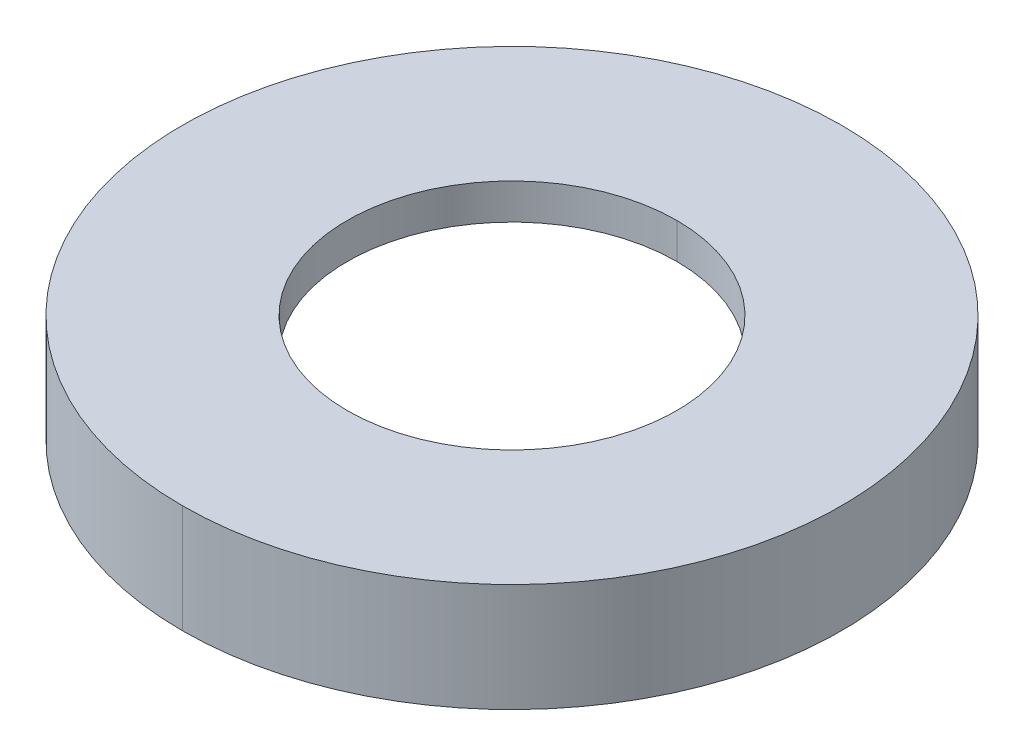
ISO-10303-21;
HEADER;
FILE_DESCRIPTION(('STEP AP214'),'2;1');
FILE_NAME('part.step','',(''),(''),'','','');
FILE_SCHEMA(('AUTOMOTIVE_DESIGN { 1 0 10303 214 1 1 1 1 }'));
ENDSEC;
DATA;
#1=APPLICATION_CONTEXT('core data for automotive mechanical design processes');
#2=APPLICATION_PROTOCOL_DEFINITION('international standard','automotive_design',2000,#1);
#3=PRODUCT_CONTEXT('',#1,'mechanical');
#4=PRODUCT('Part','Part','',(#3));
#5=PRODUCT_RELATED_PRODUCT_CATEGORY('part','',(#4));
#6=PRODUCT_DEFINITION_FORMATION('','',#4);
#7=PRODUCT_DEFINITION_CONTEXT('part definition',#1,'design');
#8=PRODUCT_DEFINITION('design','',#6,#7);
#9=PRODUCT_DEFINITION_SHAPE('','',#8);
#10=(LENGTH_UNIT() NAMED_UNIT(*) SI_UNIT(.MILLI.,.METRE.));
#11=(NAMED_UNIT(*) PLANE_ANGLE_UNIT() SI_UNIT($,.RADIAN.));
#12=(NAMED_UNIT(*) SI_UNIT($,.STERADIAN.) SOLID_ANGLE_UNIT());
#13=UNCERTAINTY_MEASURE_WITH_UNIT(LENGTH_MEASURE(1.E-05),#10,'distance_accuracy_value','');
#14=(GEOMETRIC_REPRESENTATION_CONTEXT(3) GLOBAL_UNCERTAINTY_ASSIGNED_CONTEXT((#13)) GLOBAL_UNIT_ASSIGNED_CONTEXT((#10,
#11,#12)) REPRESENTATION_CONTEXT('',''));
#15=CARTESIAN_POINT('',(0.,0.,0.));
#16=DIRECTION('',(0.,0.,1.));
#17=DIRECTION('',(1.,0.,0.));
#18=AXIS2_PLACEMENT_3D('',#15,#16,#17);
#19=CARTESIAN_POINT('',(2.79398899849514E-13,-5.2999999999933,0.));
#20=DIRECTION('',(0.,-1.,0.));
#21=DIRECTION('',(0.,0.,-1.));
#22=AXIS2_PLACEMENT_3D('',#19,#20,#21);
#23=DEGENERATE_TOROIDAL_SURFACE('',#22,2.02725465393598,6.99999999999153,.T.);
#24=CARTESIAN_POINT('',(-3.96438524369324E-13,0.966382675735436,0.));
#25=DIRECTION('',(0.,1.,0.));
#26=DIRECTION('',(0.,0.,1.));
#27=AXIS2_PLACEMENT_3D('',#24,#25,#26);
#28=CIRCLE('',#27,5.14694184357633);
#29=CARTESIAN_POINT('',(0.,0.966382675735494,-5.14694184357629));
#30=VERTEX_POINT('',#29);
#31=CARTESIAN_POINT('',(0.,0.966382675735459,5.14694184357637));
#32=VERTEX_POINT('',#31);
#33=EDGE_CURVE('E93',#30,#32,#28,.T.);
#34=ORIENTED_EDGE('',*,*,#33,.T.);
#35=CARTESIAN_POINT('',(-1.36018807453488E-12,-5.29999999999346,2.0272546539361));
#36=DIRECTION('',(1.,-2.06017321186292E-13,0.));
#37=DIRECTION('',(2.06017321186292E-13,1.,0.));
#38=AXIS2_PLACEMENT_3D('',#35,#36,#37);
#39=CIRCLE('',#38,6.99999999999159);
#40=CARTESIAN_POINT('',(0.,1.19678670968651E-13,6.60000000000011));
#41=VERTEX_POINT('',#40);
#42=EDGE_CURVE('E70',#32,#41,#39,.T.);
#43=ORIENTED_EDGE('',*,*,#42,.T.);
#44=CARTESIAN_POINT('',(2.78692796934605E-13,1.196959198424E-13,0.));
#45=DIRECTION('',(0.,-1.,0.));
#46=DIRECTION('',(0.,0.,-1.));
#47=AXIS2_PLACEMENT_3D('',#44,#45,#46);
#48=CIRCLE('',#47,6.6000000000001);
#49=CARTESIAN_POINT('',(-1.57992819598177E-13,1.18776811483181E-13,-6.60000000000011));
#50=VERTEX_POINT('',#49);
#51=EDGE_CURVE('E21',#41,#50,#48,.T.);
#52=ORIENTED_EDGE('',*,*,#51,.T.);
#53=CARTESIAN_POINT('',(-1.34405308198224E-12,-5.29999999999336,-2.02725465393615));
#54=DIRECTION('',(1.,-2.06430794315097E-13,0.));
#55=DIRECTION('',(2.06430794315097E-13,1.,0.));
#56=AXIS2_PLACEMENT_3D('',#53,#54,#55);
#57=CIRCLE('',#56,6.99999999999148);
#58=EDGE_CURVE('E67',#50,#30,#57,.T.);
#59=ORIENTED_EDGE('',*,*,#58,.T.);
#60=EDGE_LOOP('',(#34,#43,#52,#59));
#61=FACE_BOUND('',#60,.T.);
#62=ADVANCED_FACE('F17',(#61),#23,.F.);
#63=CARTESIAN_POINT('',(-2.79398899849514E-13,-5.2999999999933,0.));
#64=DIRECTION('',(0.,-1.,0.));
#65=DIRECTION('',(0.,0.,-1.));
#66=AXIS2_PLACEMENT_3D('',#63,#64,#65);
#67=DEGENERATE_TOROIDAL_SURFACE('',#66,2.02725465393598,6.99999999999153,.T.);
#68=CARTESIAN_POINT('',(3.96438524369324E-13,0.966382675735436,0.));
#69=DIRECTION('',(0.,1.,0.));
#70=DIRECTION('',(0.,0.,1.));
#71=AXIS2_PLACEMENT_3D('',#68,#69,#70);
#72=CIRCLE('',#71,5.14694184357633);
#73=EDGE_CURVE('E98',#32,#30,#72,.T.);
#74=ORIENTED_EDGE('',*,*,#73,.T.);
#75=ORIENTED_EDGE('',*,*,#58,.F.);
#76=CARTESIAN_POINT('',(-2.78692796934605E-13,1.196959198424E-13,0.));
#77=DIRECTION('',(0.,-1.,0.));
#78=DIRECTION('',(0.,0.,-1.));
#79=AXIS2_PLACEMENT_3D('',#76,#77,#78);
#80=CIRCLE('',#79,6.6000000000001);
#81=EDGE_CURVE('E118',#50,#41,#80,.T.);
#82=ORIENTED_EDGE('',*,*,#81,.T.);
#83=ORIENTED_EDGE('',*,*,#42,.F.);
#84=EDGE_LOOP('',(#74,#75,#82,#83));
#85=FACE_BOUND('',#84,.T.);
#86=ADVANCED_FACE('F141',(#85),#67,.F.);
#87=CARTESIAN_POINT('',(-6.6,0.,0.));
#88=DIRECTION('',(0.,1.,0.));
#89=DIRECTION('',(0.,0.,1.));
#90=AXIS2_PLACEMENT_3D('',#87,#88,#89);
#91=PLANE('',#90);
#92=ORIENTED_EDGE('',*,*,#51,.F.);
#93=ORIENTED_EDGE('',*,*,#81,.F.);
#94=EDGE_LOOP('',(#92,#93));
#95=FACE_BOUND('',#94,.T.);
#96=CARTESIAN_POINT('',(0.,0.,0.));
#97=DIRECTION('',(0.,-1.,0.));
#98=DIRECTION('',(0.,0.,-1.));
#99=AXIS2_PLACEMENT_3D('',#96,#97,#98);
#100=CIRCLE('',#99,7.);
#101=CARTESIAN_POINT('',(0.,0.,7.));
#102=VERTEX_POINT('',#101);
#103=CARTESIAN_POINT('',(0.,0.,-7.));
#104=VERTEX_POINT('',#103);
#105=EDGE_CURVE('E88',#102,#104,#100,.F.);
#106=ORIENTED_EDGE('',*,*,#105,.F.);
#107=CARTESIAN_POINT('',(0.,0.,0.));
#108=DIRECTION('',(0.,-1.,0.));
#109=DIRECTION('',(0.,0.,-1.));
#110=AXIS2_PLACEMENT_3D('',#107,#108,#109);
#111=CIRCLE('',#110,7.);
#112=EDGE_CURVE('E97',#104,#102,#111,.F.);
#113=ORIENTED_EDGE('',*,*,#112,.F.);
#114=EDGE_LOOP('',(#106,#113));
#115=FACE_BOUND('',#114,.T.);
#116=ADVANCED_FACE('F143',(#95,#115),#91,.F.);
#117=CARTESIAN_POINT('',(0.,-5.30000000000853,0.));
#118=DIRECTION('',(0.,-1.,0.));
#119=DIRECTION('',(0.,0.,-1.));
#120=AXIS2_PLACEMENT_3D('',#117,#118,#119);
#121=DEGENERATE_TOROIDAL_SURFACE('',#120,2.02725465392696,7.00000000000907,.T.);
#122=ORIENTED_EDGE('',*,*,#33,.F.);
#123=CARTESIAN_POINT('',(-4.77187071071039E-13,-5.30000000000768,-2.02725465392719));
#124=DIRECTION('',(1.,0.,0.));
#125=DIRECTION('',(0.,1.,0.));
#126=AXIS2_PLACEMENT_3D('',#123,#124,#125);
#127=CIRCLE('',#126,7.0000000000082);
#128=CARTESIAN_POINT('',(0.,1.54331945371793,-3.49999999999995));
#129=VERTEX_POINT('',#128);
#130=EDGE_CURVE('E91',#30,#129,#127,.T.);
#131=ORIENTED_EDGE('',*,*,#130,.T.);
#132=CARTESIAN_POINT('',(0.,1.543319453718,0.));
#133=DIRECTION('',(0.,1.,0.));
#134=DIRECTION('',(0.,0.,1.));
#135=AXIS2_PLACEMENT_3D('',#132,#133,#134);
#136=CIRCLE('',#135,3.5);
#137=CARTESIAN_POINT('',(0.,1.54331945371792,3.5));
#138=VERTEX_POINT('',#137);
#139=EDGE_CURVE('E80',#129,#138,#136,.T.);
#140=ORIENTED_EDGE('',*,*,#139,.T.);
#141=CARTESIAN_POINT('',(-5.40296791089685E-13,-5.30000000000761,2.02725465392721));
#142=DIRECTION('',(1.,0.,0.));
#143=DIRECTION('',(0.,1.,0.));
#144=AXIS2_PLACEMENT_3D('',#141,#142,#143);
#145=CIRCLE('',#144,7.00000000000813);
#146=EDGE_CURVE('E104',#138,#32,#145,.T.);
#147=ORIENTED_EDGE('',*,*,#146,.T.);
#148=EDGE_LOOP('',(#122,#131,#140,#147));
#149=FACE_BOUND('',#148,.T.);
#150=ADVANCED_FACE('F92',(#149),#121,.F.);
#151=CARTESIAN_POINT('',(0.,-5.30000000000853,0.));
#152=DIRECTION('',(0.,-1.,0.));
#153=DIRECTION('',(0.,0.,-1.));
#154=AXIS2_PLACEMENT_3D('',#151,#152,#153);
#155=DEGENERATE_TOROIDAL_SURFACE('',#154,2.02725465392696,7.00000000000907,.T.);
#156=ORIENTED_EDGE('',*,*,#73,.F.);
#157=ORIENTED_EDGE('',*,*,#146,.F.);
#158=CARTESIAN_POINT('',(0.,1.543319453718,0.));
#159=DIRECTION('',(0.,1.,0.));
#160=DIRECTION('',(0.,0.,1.));
#161=AXIS2_PLACEMENT_3D('',#158,#159,#160);
#162=CIRCLE('',#161,3.5);
#163=EDGE_CURVE('E101',#138,#129,#162,.T.);
#164=ORIENTED_EDGE('',*,*,#163,.T.);
#165=ORIENTED_EDGE('',*,*,#130,.F.);
#166=EDGE_LOOP('',(#156,#157,#164,#165));
#167=FACE_BOUND('',#166,.T.);
#168=ADVANCED_FACE('F19',(#167),#155,.F.);
#169=CARTESIAN_POINT('',(0.,0.,0.));
#170=DIRECTION('',(0.,-1.,0.));
#171=DIRECTION('',(0.,0.,-1.));
#172=AXIS2_PLACEMENT_3D('',#169,#170,#171);
#173=CYLINDRICAL_SURFACE('',#172,7.);
#174=DIRECTION('',(0.,-1.,0.));
#175=VECTOR('',#174,1.);
#176=CARTESIAN_POINT('',(0.,0.,-7.));
#177=LINE('',#176,#175);
#178=CARTESIAN_POINT('',(0.,2.3,-7.));
#179=VERTEX_POINT('',#178);
#180=EDGE_CURVE('E139',#104,#179,#177,.F.);
#181=ORIENTED_EDGE('',*,*,#180,.F.);
#182=ORIENTED_EDGE('',*,*,#112,.T.);
#183=DIRECTION('',(0.,-1.,0.));
#184=VECTOR('',#183,1.);
#185=CARTESIAN_POINT('',(0.,0.,7.));
#186=LINE('',#185,#184);
#187=CARTESIAN_POINT('',(0.,2.3,7.));
#188=VERTEX_POINT('',#187);
#189=EDGE_CURVE('E138',#188,#102,#186,.T.);
#190=ORIENTED_EDGE('',*,*,#189,.F.);
#191=CARTESIAN_POINT('',(0.,2.3,0.));
#192=DIRECTION('',(0.,-1.,0.));
#193=DIRECTION('',(0.,0.,-1.));
#194=AXIS2_PLACEMENT_3D('',#191,#192,#193);
#195=CIRCLE('',#194,7.);
#196=EDGE_CURVE('E102',#188,#179,#195,.T.);
#197=ORIENTED_EDGE('',*,*,#196,.T.);
#198=EDGE_LOOP('',(#181,#182,#190,#197));
#199=FACE_BOUND('',#198,.T.);
#200=ADVANCED_FACE('F167',(#199),#173,.T.);
#201=CARTESIAN_POINT('',(0.,0.,0.));
#202=DIRECTION('',(0.,-1.,0.));
#203=DIRECTION('',(0.,0.,-1.));
#204=AXIS2_PLACEMENT_3D('',#201,#202,#203);
#205=CYLINDRICAL_SURFACE('',#204,7.);
#206=ORIENTED_EDGE('',*,*,#189,.T.);
#207=ORIENTED_EDGE('',*,*,#105,.T.);
#208=ORIENTED_EDGE('',*,*,#180,.T.);
#209=CARTESIAN_POINT('',(0.,2.3,0.));
#210=DIRECTION('',(0.,-1.,0.));
#211=DIRECTION('',(0.,0.,-1.));
#212=AXIS2_PLACEMENT_3D('',#209,#210,#211);
#213=CIRCLE('',#212,7.);
#214=EDGE_CURVE('E131',#179,#188,#213,.T.);
#215=ORIENTED_EDGE('',*,*,#214,.T.);
#216=EDGE_LOOP('',(#206,#207,#208,#215));
#217=FACE_BOUND('',#216,.T.);
#218=ADVANCED_FACE('F164',(#217),#205,.T.);
#219=CARTESIAN_POINT('',(0.,0.,0.));
#220=DIRECTION('',(0.,1.,0.));
#221=DIRECTION('',(0.,0.,1.));
#222=AXIS2_PLACEMENT_3D('',#219,#220,#221);
#223=CYLINDRICAL_SURFACE('',#222,3.5);
#224=ORIENTED_EDGE('',*,*,#139,.F.);
#225=DIRECTION('',(0.,1.,0.));
#226=VECTOR('',#225,1.);
#227=CARTESIAN_POINT('',(0.,0.,-3.5));
#228=LINE('',#227,#226);
#229=CARTESIAN_POINT('',(0.,2.3,-3.5));
#230=VERTEX_POINT('',#229);
#231=EDGE_CURVE('E85',#129,#230,#228,.T.);
#232=ORIENTED_EDGE('',*,*,#231,.T.);
#233=CARTESIAN_POINT('',(0.,2.3,0.));
#234=DIRECTION('',(0.,1.,0.));
#235=DIRECTION('',(0.,0.,1.));
#236=AXIS2_PLACEMENT_3D('',#233,#234,#235);
#237=CIRCLE('',#236,3.5);
#238=CARTESIAN_POINT('',(0.,2.3,3.5));
#239=VERTEX_POINT('',#238);
#240=EDGE_CURVE('E27',#230,#239,#237,.T.);
#241=ORIENTED_EDGE('',*,*,#240,.T.);
#242=DIRECTION('',(0.,1.,0.));
#243=VECTOR('',#242,1.);
#244=CARTESIAN_POINT('',(0.,0.,3.5));
#245=LINE('',#244,#243);
#246=EDGE_CURVE('E35',#239,#138,#245,.F.);
#247=ORIENTED_EDGE('',*,*,#246,.T.);
#248=EDGE_LOOP('',(#224,#232,#241,#247));
#249=FACE_BOUND('',#248,.T.);
#250=ADVANCED_FACE('F82',(#249),#223,.F.);
#251=CARTESIAN_POINT('',(0.,0.,0.));
#252=DIRECTION('',(0.,1.,0.));
#253=DIRECTION('',(0.,0.,1.));
#254=AXIS2_PLACEMENT_3D('',#251,#252,#253);
#255=CYLINDRICAL_SURFACE('',#254,3.5);
#256=ORIENTED_EDGE('',*,*,#163,.F.);
#257=ORIENTED_EDGE('',*,*,#246,.F.);
#258=CARTESIAN_POINT('',(0.,2.3,0.));
#259=DIRECTION('',(0.,1.,0.));
#260=DIRECTION('',(0.,0.,1.));
#261=AXIS2_PLACEMENT_3D('',#258,#259,#260);
#262=CIRCLE('',#261,3.5);
#263=EDGE_CURVE('E11',#239,#230,#262,.T.);
#264=ORIENTED_EDGE('',*,*,#263,.T.);
#265=ORIENTED_EDGE('',*,*,#231,.F.);
#266=EDGE_LOOP('',(#256,#257,#264,#265));
#267=FACE_BOUND('',#266,.T.);
#268=ADVANCED_FACE('F100',(#267),#255,.F.);
#269=CARTESIAN_POINT('',(-7.,2.3,0.));
#270=DIRECTION('',(0.,-1.,0.));
#271=DIRECTION('',(0.,0.,-1.));
#272=AXIS2_PLACEMENT_3D('',#269,#270,#271);
#273=PLANE('',#272);
#274=ORIENTED_EDGE('',*,*,#240,.F.);
#275=ORIENTED_EDGE('',*,*,#263,.F.);
#276=EDGE_LOOP('',(#274,#275));
#277=FACE_BOUND('',#276,.T.);
#278=ORIENTED_EDGE('',*,*,#196,.F.);
#279=ORIENTED_EDGE('',*,*,#214,.F.);
#280=EDGE_LOOP('',(#278,#279));
#281=FACE_BOUND('',#280,.T.);
#282=ADVANCED_FACE('F152',(#277,#281),#273,.F.);
#283=CLOSED_SHELL('',(#62,#86,#116,#150,#168,#200,#218,#250,#268,#282));
#284=MANIFOLD_SOLID_BREP('B1',#283);
#285=ADVANCED_BREP_SHAPE_REPRESENTATION('',(#18,#284),#14);
#286=SHAPE_DEFINITION_REPRESENTATION(#9,#285);
ENDSEC;
END-ISO-10303-21;
